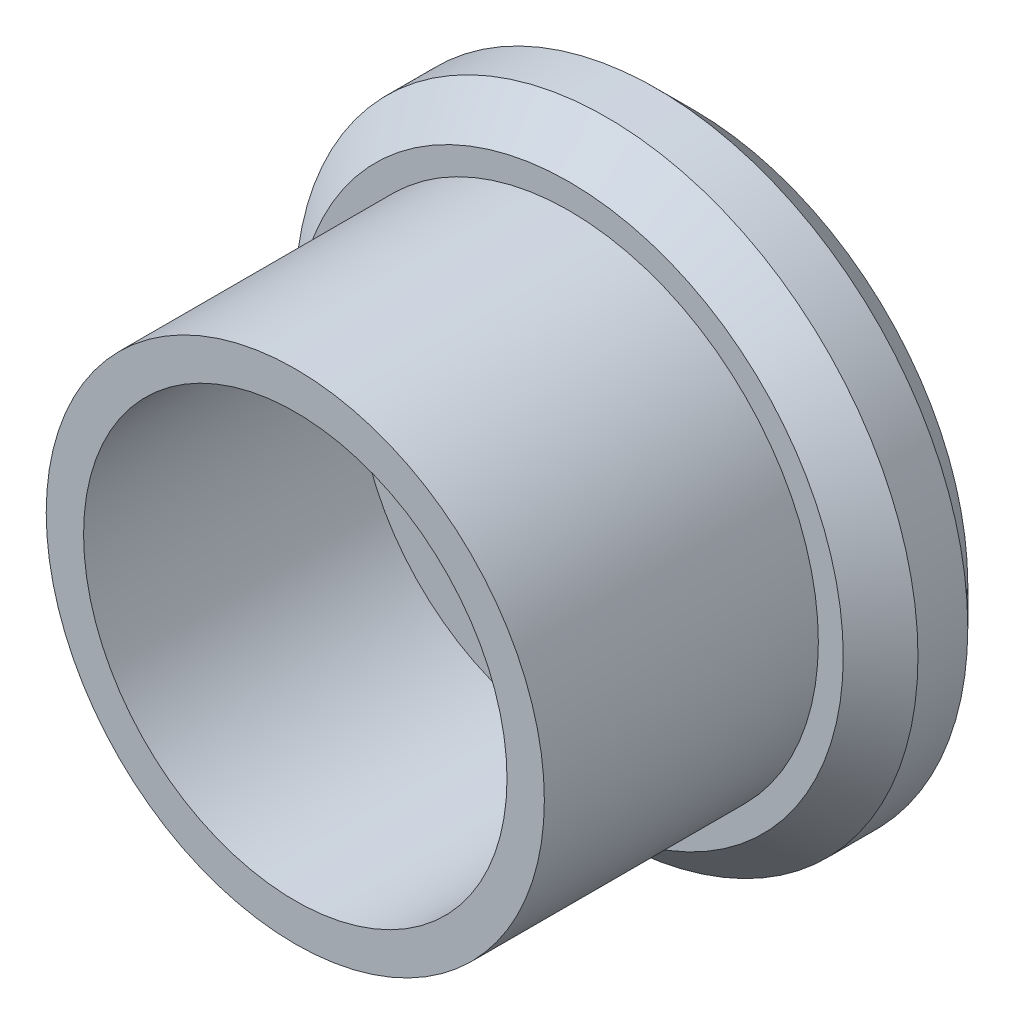
ISO-10303-21;
HEADER;
FILE_DESCRIPTION(('STEP AP214'),'2;1');
FILE_NAME('part.step','',(''),(''),'','','');
FILE_SCHEMA(('AUTOMOTIVE_DESIGN { 1 0 10303 214 1 1 1 1 }'));
ENDSEC;
DATA;
#1=APPLICATION_CONTEXT('core data for automotive mechanical design processes');
#2=APPLICATION_PROTOCOL_DEFINITION('international standard','automotive_design',2000,#1);
#3=PRODUCT_CONTEXT('',#1,'mechanical');
#4=PRODUCT('Part','Part','',(#3));
#5=PRODUCT_RELATED_PRODUCT_CATEGORY('part','',(#4));
#6=PRODUCT_DEFINITION_FORMATION('','',#4);
#7=PRODUCT_DEFINITION_CONTEXT('part definition',#1,'design');
#8=PRODUCT_DEFINITION('design','',#6,#7);
#9=PRODUCT_DEFINITION_SHAPE('','',#8);
#10=(LENGTH_UNIT() NAMED_UNIT(*) SI_UNIT(.MILLI.,.METRE.));
#11=(NAMED_UNIT(*) PLANE_ANGLE_UNIT() SI_UNIT($,.RADIAN.));
#12=(NAMED_UNIT(*) SI_UNIT($,.STERADIAN.) SOLID_ANGLE_UNIT());
#13=UNCERTAINTY_MEASURE_WITH_UNIT(LENGTH_MEASURE(1.E-05),#10,'distance_accuracy_value','');
#14=(GEOMETRIC_REPRESENTATION_CONTEXT(3) GLOBAL_UNCERTAINTY_ASSIGNED_CONTEXT((#13)) GLOBAL_UNIT_ASSIGNED_CONTEXT((#10,
#11,#12)) REPRESENTATION_CONTEXT('',''));
#15=CARTESIAN_POINT('',(0.,0.,0.));
#16=DIRECTION('',(0.,0.,1.));
#17=DIRECTION('',(1.,0.,0.));
#18=AXIS2_PLACEMENT_3D('',#15,#16,#17);
#19=CARTESIAN_POINT('',(0.,0.,22.));
#20=DIRECTION('',(0.,0.,1.));
#21=DIRECTION('',(1.,0.,0.));
#22=AXIS2_PLACEMENT_3D('',#19,#20,#21);
#23=PLANE('',#22);
#24=CARTESIAN_POINT('',(0.,0.,22.));
#25=DIRECTION('',(0.,0.,1.));
#26=DIRECTION('',(1.,0.,0.));
#27=AXIS2_PLACEMENT_3D('',#24,#25,#26);
#28=CIRCLE('',#27,20.);
#29=CARTESIAN_POINT('',(20.,0.,22.));
#30=VERTEX_POINT('',#29);
#31=EDGE_CURVE('E55',#30,#30,#28,.T.);
#32=ORIENTED_EDGE('',*,*,#31,.T.);
#33=EDGE_LOOP('',(#32));
#34=FACE_BOUND('',#33,.T.);
#35=CARTESIAN_POINT('',(0.,0.,22.));
#36=DIRECTION('',(0.,0.,1.));
#37=DIRECTION('',(1.,0.,0.));
#38=AXIS2_PLACEMENT_3D('',#35,#36,#37);
#39=CIRCLE('',#38,17.);
#40=CARTESIAN_POINT('',(17.,0.,22.));
#41=VERTEX_POINT('',#40);
#42=EDGE_CURVE('E58',#41,#41,#39,.T.);
#43=ORIENTED_EDGE('',*,*,#42,.F.);
#44=EDGE_LOOP('',(#43));
#45=FACE_BOUND('',#44,.T.);
#46=ADVANCED_FACE('F35',(#34,#45),#23,.T.);
#47=CARTESIAN_POINT('',(0.,0.,22.));
#48=DIRECTION('',(0.,0.,-1.));
#49=DIRECTION('',(-1.,0.,0.));
#50=AXIS2_PLACEMENT_3D('',#47,#48,#49);
#51=CYLINDRICAL_SURFACE('',#50,20.);
#52=ORIENTED_EDGE('',*,*,#31,.F.);
#53=EDGE_LOOP('',(#52));
#54=FACE_BOUND('',#53,.T.);
#55=CARTESIAN_POINT('',(0.,0.,0.));
#56=DIRECTION('',(0.,0.,-1.));
#57=DIRECTION('',(-1.,0.,0.));
#58=AXIS2_PLACEMENT_3D('',#55,#56,#57);
#59=CIRCLE('',#58,20.);
#60=CARTESIAN_POINT('',(-20.,0.,0.));
#61=VERTEX_POINT('',#60);
#62=EDGE_CURVE('E62',#61,#61,#59,.T.);
#63=ORIENTED_EDGE('',*,*,#62,.F.);
#64=EDGE_LOOP('',(#63));
#65=FACE_BOUND('',#64,.T.);
#66=ADVANCED_FACE('F70',(#54,#65),#51,.T.);
#67=CARTESIAN_POINT('',(0.,0.,22.));
#68=DIRECTION('',(0.,0.,-1.));
#69=DIRECTION('',(-1.,0.,0.));
#70=AXIS2_PLACEMENT_3D('',#67,#68,#69);
#71=CYLINDRICAL_SURFACE('',#70,17.);
#72=ORIENTED_EDGE('',*,*,#42,.T.);
#73=EDGE_LOOP('',(#72));
#74=FACE_BOUND('',#73,.T.);
#75=CARTESIAN_POINT('',(0.,0.,0.));
#76=DIRECTION('',(0.,0.,1.));
#77=DIRECTION('',(1.,0.,0.));
#78=AXIS2_PLACEMENT_3D('',#75,#76,#77);
#79=CIRCLE('',#78,17.);
#80=CARTESIAN_POINT('',(17.,0.,0.));
#81=VERTEX_POINT('',#80);
#82=EDGE_CURVE('E59',#81,#81,#79,.T.);
#83=ORIENTED_EDGE('',*,*,#82,.F.);
#84=EDGE_LOOP('',(#83));
#85=FACE_BOUND('',#84,.T.);
#86=ADVANCED_FACE('F72',(#74,#85),#71,.F.);
#87=CARTESIAN_POINT('',(0.,0.,0.));
#88=DIRECTION('',(0.,0.,-1.));
#89=DIRECTION('',(-1.,0.,0.));
#90=AXIS2_PLACEMENT_3D('',#87,#88,#89);
#91=PLANE('',#90);
#92=ORIENTED_EDGE('',*,*,#82,.T.);
#93=EDGE_LOOP('',(#92));
#94=FACE_BOUND('',#93,.T.);
#95=ADVANCED_FACE('F79',(#94),#91,.F.);
#96=CARTESIAN_POINT('',(0.,0.,0.));
#97=DIRECTION('',(0.,0.,-1.));
#98=DIRECTION('',(-1.,0.,0.));
#99=AXIS2_PLACEMENT_3D('',#96,#97,#98);
#100=CIRCLE('',#99,22.);
#101=CARTESIAN_POINT('',(-22.,0.,0.));
#102=VERTEX_POINT('',#101);
#103=EDGE_CURVE('E10',#102,#102,#100,.F.);
#104=ORIENTED_EDGE('',*,*,#103,.T.);
#105=EDGE_LOOP('',(#104));
#106=FACE_BOUND('',#105,.T.);
#107=ORIENTED_EDGE('',*,*,#62,.T.);
#108=EDGE_LOOP('',(#107));
#109=FACE_BOUND('',#108,.T.);
#110=ADVANCED_FACE('F68',(#106,#109),#91,.F.);
#111=CARTESIAN_POINT('',(0.,0.,-10.));
#112=DIRECTION('',(0.,0.,1.));
#113=DIRECTION('',(1.,0.,0.));
#114=AXIS2_PLACEMENT_3D('',#111,#112,#113);
#115=CYLINDRICAL_SURFACE('',#114,25.);
#116=CARTESIAN_POINT('',(0.,0.,-6.99999999999999));
#117=DIRECTION('',(0.,0.,-1.));
#118=DIRECTION('',(-1.,0.,0.));
#119=AXIS2_PLACEMENT_3D('',#116,#117,#118);
#120=CIRCLE('',#119,25.);
#121=CARTESIAN_POINT('',(25.,0.,-6.99999999999999));
#122=VERTEX_POINT('',#121);
#123=EDGE_CURVE('E42',#122,#122,#120,.F.);
#124=ORIENTED_EDGE('',*,*,#123,.T.);
#125=EDGE_LOOP('',(#124));
#126=FACE_BOUND('',#125,.T.);
#127=CARTESIAN_POINT('',(0.,0.,-3.00000000000001));
#128=DIRECTION('',(0.,0.,-1.));
#129=DIRECTION('',(-1.,0.,0.));
#130=AXIS2_PLACEMENT_3D('',#127,#128,#129);
#131=CIRCLE('',#130,25.);
#132=CARTESIAN_POINT('',(-25.,0.,-3.00000000000001));
#133=VERTEX_POINT('',#132);
#134=EDGE_CURVE('E46',#133,#133,#131,.T.);
#135=ORIENTED_EDGE('',*,*,#134,.T.);
#136=EDGE_LOOP('',(#135));
#137=FACE_BOUND('',#136,.T.);
#138=ADVANCED_FACE('F94',(#126,#137),#115,.T.);
#139=CARTESIAN_POINT('',(0.,0.,-10.));
#140=DIRECTION('',(0.,0.,-1.));
#141=DIRECTION('',(-1.,0.,0.));
#142=AXIS2_PLACEMENT_3D('',#139,#140,#141);
#143=PLANE('',#142);
#144=CARTESIAN_POINT('',(0.,0.,-10.));
#145=DIRECTION('',(0.,0.,-1.));
#146=DIRECTION('',(-1.,0.,0.));
#147=AXIS2_PLACEMENT_3D('',#144,#145,#146);
#148=CIRCLE('',#147,22.);
#149=CARTESIAN_POINT('',(22.,0.,-10.));
#150=VERTEX_POINT('',#149);
#151=EDGE_CURVE('E50',#150,#150,#148,.T.);
#152=ORIENTED_EDGE('',*,*,#151,.T.);
#153=EDGE_LOOP('',(#152));
#154=FACE_BOUND('',#153,.T.);
#155=ADVANCED_FACE('F87',(#154),#143,.T.);
#156=CARTESIAN_POINT('',(0.,0.,-10.));
#157=DIRECTION('',(0.,0.,1.));
#158=DIRECTION('',(1.,0.,0.));
#159=AXIS2_PLACEMENT_3D('',#156,#157,#158);
#160=CONICAL_SURFACE('',#159,22.,0.785398163397447);
#161=CARTESIAN_POINT('',(25.,0.,-6.99999999999999));
#162=CARTESIAN_POINT('',(24.96875,0.,-7.03124999999999));
#163=CARTESIAN_POINT('',(24.9375,0.,-7.06249999999999));
#164=CARTESIAN_POINT('',(24.875,0.,-7.12499999999999));
#165=CARTESIAN_POINT('',(24.84375,0.,-7.15624999999999));
#166=CARTESIAN_POINT('',(24.78125,0.,-7.21874999999999));
#167=CARTESIAN_POINT('',(24.75,0.,-7.24999999999999));
#168=CARTESIAN_POINT('',(24.6875,0.,-7.31249999999999));
#169=CARTESIAN_POINT('',(24.65625,0.,-7.34374999999999));
#170=CARTESIAN_POINT('',(24.59375,0.,-7.40624999999999));
#171=CARTESIAN_POINT('',(24.5625,0.,-7.43749999999999));
#172=CARTESIAN_POINT('',(24.5,0.,-7.49999999999999));
#173=CARTESIAN_POINT('',(24.46875,0.,-7.53124999999999));
#174=CARTESIAN_POINT('',(24.40625,0.,-7.59374999999999));
#175=CARTESIAN_POINT('',(24.375,0.,-7.62499999999999));
#176=CARTESIAN_POINT('',(24.3125,0.,-7.68749999999999));
#177=CARTESIAN_POINT('',(24.28125,0.,-7.71874999999999));
#178=CARTESIAN_POINT('',(24.21875,0.,-7.78124999999999));
#179=CARTESIAN_POINT('',(24.1875,0.,-7.81249999999999));
#180=CARTESIAN_POINT('',(24.125,0.,-7.87499999999999));
#181=CARTESIAN_POINT('',(24.09375,0.,-7.90624999999999));
#182=CARTESIAN_POINT('',(24.03125,0.,-7.96874999999999));
#183=CARTESIAN_POINT('',(24.,0.,-8.));
#184=CARTESIAN_POINT('',(23.9375,0.,-8.0625));
#185=CARTESIAN_POINT('',(23.90625,0.,-8.09374999999999));
#186=CARTESIAN_POINT('',(23.84375,0.,-8.15624999999999));
#187=CARTESIAN_POINT('',(23.8125,0.,-8.18749999999999));
#188=CARTESIAN_POINT('',(23.75,0.,-8.24999999999999));
#189=CARTESIAN_POINT('',(23.71875,0.,-8.28125));
#190=CARTESIAN_POINT('',(23.65625,0.,-8.34375));
#191=CARTESIAN_POINT('',(23.625,0.,-8.375));
#192=CARTESIAN_POINT('',(23.5625,0.,-8.4375));
#193=CARTESIAN_POINT('',(23.53125,0.,-8.46875));
#194=CARTESIAN_POINT('',(23.46875,0.,-8.53125));
#195=CARTESIAN_POINT('',(23.4375,0.,-8.5625));
#196=CARTESIAN_POINT('',(23.375,0.,-8.625));
#197=CARTESIAN_POINT('',(23.34375,0.,-8.65625));
#198=CARTESIAN_POINT('',(23.28125,0.,-8.71875));
#199=CARTESIAN_POINT('',(23.25,0.,-8.75));
#200=CARTESIAN_POINT('',(23.1875,0.,-8.8125));
#201=CARTESIAN_POINT('',(23.15625,0.,-8.84375));
#202=CARTESIAN_POINT('',(23.09375,0.,-8.90625));
#203=CARTESIAN_POINT('',(23.0625,0.,-8.9375));
#204=CARTESIAN_POINT('',(23.,0.,-9.));
#205=CARTESIAN_POINT('',(22.96875,0.,-9.03125));
#206=CARTESIAN_POINT('',(22.90625,0.,-9.09375));
#207=CARTESIAN_POINT('',(22.875,0.,-9.125));
#208=CARTESIAN_POINT('',(22.8125,0.,-9.1875));
#209=CARTESIAN_POINT('',(22.78125,0.,-9.21875));
#210=CARTESIAN_POINT('',(22.71875,0.,-9.28125));
#211=CARTESIAN_POINT('',(22.6875,0.,-9.3125));
#212=CARTESIAN_POINT('',(22.625,0.,-9.375));
#213=CARTESIAN_POINT('',(22.59375,0.,-9.40625));
#214=CARTESIAN_POINT('',(22.53125,0.,-9.46875));
#215=CARTESIAN_POINT('',(22.5,0.,-9.5));
#216=CARTESIAN_POINT('',(22.4375,0.,-9.5625));
#217=CARTESIAN_POINT('',(22.40625,0.,-9.59375));
#218=CARTESIAN_POINT('',(22.34375,0.,-9.65625));
#219=CARTESIAN_POINT('',(22.3125,0.,-9.6875));
#220=CARTESIAN_POINT('',(22.25,0.,-9.75));
#221=CARTESIAN_POINT('',(22.21875,0.,-9.78125));
#222=CARTESIAN_POINT('',(22.15625,0.,-9.84375));
#223=CARTESIAN_POINT('',(22.125,0.,-9.875));
#224=CARTESIAN_POINT('',(22.0625,0.,-9.9375));
#225=CARTESIAN_POINT('',(22.03125,0.,-9.96875));
#226=CARTESIAN_POINT('',(22.,0.,-10.));
#227=B_SPLINE_CURVE_WITH_KNOTS('',3,(#161,#162,#163,#164,#165,#166,#167,#168,#169,#170,#171,
#172,#173,#174,#175,#176,#177,#178,#179,#180,#181,#182,#183,#184,#185,#186,#187,#188,#189,#190,
#191,#192,#193,#194,#195,#196,#197,#198,#199,#200,#201,#202,#203,#204,#205,#206,#207,#208,#209,
#210,#211,#212,#213,#214,#215,#216,#217,#218,#219,#220,#221,#222,#223,#224,#225,#226),
.UNSPECIFIED.,.F.,.F.,(4,2,2,2,2,2,2,2,2,2,2,2,2,2,2,2,2,2,2,2,2,2,2,2,2,2,2,2,2,2,2,2,4),(0.,
0.132582521472478,0.265165042944956,0.397747564417433,0.530330085889911,0.662912607362387,
0.795495128834864,0.928077650307342,1.06066017177982,1.1932426932523,1.32582521472478,
1.45840773619725,1.59099025766973,1.72357277914221,1.85615530061469,1.98873782208717,
2.12132034355964,2.25390286503212,2.3864853865046,2.51906790797708,2.65165042944955,
2.78423295092203,2.91681547239451,3.04939799386698,3.18198051533946,3.31456303681194,
3.44714555828442,3.5797280797569,3.71231060122937,3.84489312270185,3.97747564417433,
4.11005816564681,4.24264068711929),.UNSPECIFIED.);
#228=EDGE_CURVE('BSEAM85',#122,#150,#227,.T.);
#229=ORIENTED_EDGE('',*,*,#123,.F.);
#230=ORIENTED_EDGE('',*,*,#151,.F.);
#231=ORIENTED_EDGE('',*,*,#228,.T.);
#232=ORIENTED_EDGE('',*,*,#228,.F.);
#233=EDGE_LOOP('',(#229,#231,#230,#232));
#234=FACE_BOUND('',#233,.T.);
#235=ADVANCED_FACE('F85',(#234),#160,.T.);
#236=CARTESIAN_POINT('',(0.,0.,-3.00000000000001));
#237=DIRECTION('',(0.,0.,-1.));
#238=DIRECTION('',(-1.,0.,0.));
#239=AXIS2_PLACEMENT_3D('',#236,#237,#238);
#240=CONICAL_SURFACE('',#239,25.,0.785398163397449);
#241=ORIENTED_EDGE('',*,*,#103,.F.);
#242=EDGE_LOOP('',(#241));
#243=FACE_BOUND('',#242,.T.);
#244=ORIENTED_EDGE('',*,*,#134,.F.);
#245=EDGE_LOOP('',(#244));
#246=FACE_BOUND('',#245,.T.);
#247=ADVANCED_FACE('F37',(#243,#246),#240,.T.);
#248=CLOSED_SHELL('',(#46,#66,#86,#95,#110,#138,#155,#235,#247));
#249=MANIFOLD_SOLID_BREP('B2',#248);
#250=ADVANCED_BREP_SHAPE_REPRESENTATION('',(#18,#249),#14);
#251=SHAPE_DEFINITION_REPRESENTATION(#9,#250);
ENDSEC;
END-ISO-10303-21;
